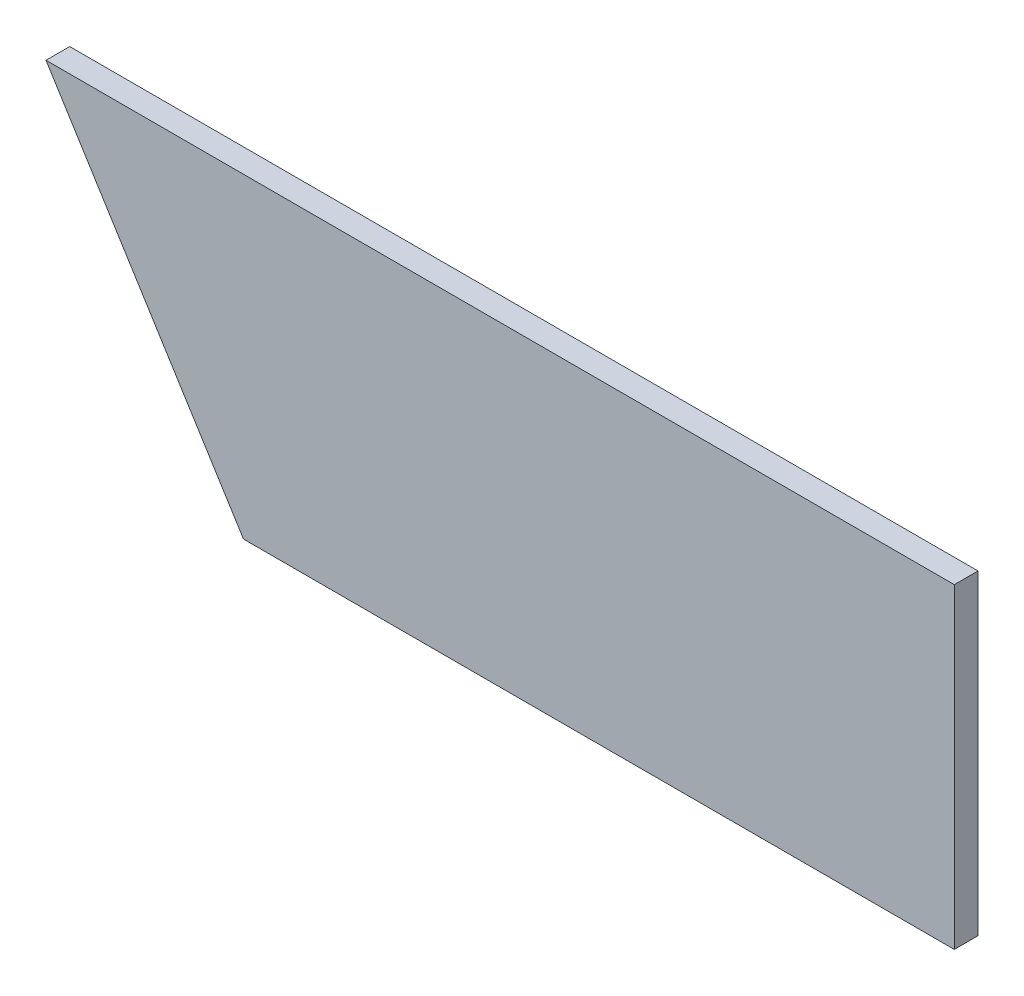
ISO-10303-21;
HEADER;
FILE_DESCRIPTION(('STEP AP214'),'2;1');
FILE_NAME('part.step','',(''),(''),'','','');
FILE_SCHEMA(('AUTOMOTIVE_DESIGN { 1 0 10303 214 1 1 1 1 }'));
ENDSEC;
DATA;
#1=APPLICATION_CONTEXT('core data for automotive mechanical design processes');
#2=APPLICATION_PROTOCOL_DEFINITION('international standard','automotive_design',2000,#1);
#3=PRODUCT_CONTEXT('',#1,'mechanical');
#4=PRODUCT('Part','Part','',(#3));
#5=PRODUCT_RELATED_PRODUCT_CATEGORY('part','',(#4));
#6=PRODUCT_DEFINITION_FORMATION('','',#4);
#7=PRODUCT_DEFINITION_CONTEXT('part definition',#1,'design');
#8=PRODUCT_DEFINITION('design','',#6,#7);
#9=PRODUCT_DEFINITION_SHAPE('','',#8);
#10=(LENGTH_UNIT() NAMED_UNIT(*) SI_UNIT(.MILLI.,.METRE.));
#11=(NAMED_UNIT(*) PLANE_ANGLE_UNIT() SI_UNIT($,.RADIAN.));
#12=(NAMED_UNIT(*) SI_UNIT($,.STERADIAN.) SOLID_ANGLE_UNIT());
#13=UNCERTAINTY_MEASURE_WITH_UNIT(LENGTH_MEASURE(1.E-05),#10,'distance_accuracy_value','');
#14=(GEOMETRIC_REPRESENTATION_CONTEXT(3) GLOBAL_UNCERTAINTY_ASSIGNED_CONTEXT((#13)) GLOBAL_UNIT_ASSIGNED_CONTEXT((#10,
#11,#12)) REPRESENTATION_CONTEXT('',''));
#15=CARTESIAN_POINT('',(0.,0.,0.));
#16=DIRECTION('',(0.,0.,1.));
#17=DIRECTION('',(1.,0.,0.));
#18=AXIS2_PLACEMENT_3D('',#15,#16,#17);
#19=CARTESIAN_POINT('',(115.,0.,-3.));
#20=DIRECTION('',(1.,0.,0.));
#21=DIRECTION('',(0.,0.,-1.));
#22=AXIS2_PLACEMENT_3D('',#19,#20,#21);
#23=PLANE('',#22);
#24=DIRECTION('',(0.,1.,0.));
#25=VECTOR('',#24,1.);
#26=CARTESIAN_POINT('',(115.,0.,0.));
#27=LINE('',#26,#25);
#28=CARTESIAN_POINT('',(115.,0.,0.));
#29=VERTEX_POINT('',#28);
#30=CARTESIAN_POINT('',(115.,40.,0.));
#31=VERTEX_POINT('',#30);
#32=EDGE_CURVE('E103',#29,#31,#27,.T.);
#33=ORIENTED_EDGE('',*,*,#32,.F.);
#34=DIRECTION('',(0.,0.,1.));
#35=VECTOR('',#34,1.);
#36=CARTESIAN_POINT('',(115.,0.,-3.));
#37=LINE('',#36,#35);
#38=CARTESIAN_POINT('',(115.,0.,-3.));
#39=VERTEX_POINT('',#38);
#40=EDGE_CURVE('E11',#39,#29,#37,.T.);
#41=ORIENTED_EDGE('',*,*,#40,.F.);
#42=DIRECTION('',(0.,1.,0.));
#43=VECTOR('',#42,1.);
#44=CARTESIAN_POINT('',(115.,0.,-3.));
#45=LINE('',#44,#43);
#46=CARTESIAN_POINT('',(115.,40.,-3.));
#47=VERTEX_POINT('',#46);
#48=EDGE_CURVE('E97',#39,#47,#45,.T.);
#49=ORIENTED_EDGE('',*,*,#48,.T.);
#50=DIRECTION('',(0.,0.,1.));
#51=VECTOR('',#50,1.);
#52=CARTESIAN_POINT('',(115.,40.,-3.));
#53=LINE('',#52,#51);
#54=EDGE_CURVE('E42',#47,#31,#53,.T.);
#55=ORIENTED_EDGE('',*,*,#54,.T.);
#56=EDGE_LOOP('',(#33,#41,#49,#55));
#57=FACE_BOUND('',#56,.T.);
#58=ADVANCED_FACE('F39',(#57),#23,.T.);
#59=CARTESIAN_POINT('',(25.,0.,-3.));
#60=DIRECTION('',(0.,-1.,0.));
#61=DIRECTION('',(1.,0.,0.));
#62=AXIS2_PLACEMENT_3D('',#59,#60,#61);
#63=PLANE('',#62);
#64=DIRECTION('',(1.,0.,0.));
#65=VECTOR('',#64,1.);
#66=CARTESIAN_POINT('',(25.,0.,0.));
#67=LINE('',#66,#65);
#68=CARTESIAN_POINT('',(25.,0.,0.));
#69=VERTEX_POINT('',#68);
#70=EDGE_CURVE('E99',#69,#29,#67,.T.);
#71=ORIENTED_EDGE('',*,*,#70,.F.);
#72=DIRECTION('',(0.,0.,1.));
#73=VECTOR('',#72,1.);
#74=CARTESIAN_POINT('',(25.,0.,-3.));
#75=LINE('',#74,#73);
#76=CARTESIAN_POINT('',(25.,0.,-3.));
#77=VERTEX_POINT('',#76);
#78=EDGE_CURVE('E48',#77,#69,#75,.T.);
#79=ORIENTED_EDGE('',*,*,#78,.F.);
#80=DIRECTION('',(1.,0.,0.));
#81=VECTOR('',#80,1.);
#82=CARTESIAN_POINT('',(25.,0.,-3.));
#83=LINE('',#82,#81);
#84=EDGE_CURVE('E94',#77,#39,#83,.T.);
#85=ORIENTED_EDGE('',*,*,#84,.T.);
#86=ORIENTED_EDGE('',*,*,#40,.T.);
#87=EDGE_LOOP('',(#71,#79,#85,#86));
#88=FACE_BOUND('',#87,.T.);
#89=ADVANCED_FACE('F113',(#88),#63,.T.);
#90=CARTESIAN_POINT('',(0.,40.,-3.));
#91=DIRECTION('',(-0.847998304005088,-0.52999894000318,0.));
#92=DIRECTION('',(0.52999894000318,-0.847998304005088,0.));
#93=AXIS2_PLACEMENT_3D('',#90,#91,#92);
#94=PLANE('',#93);
#95=DIRECTION('',(0.52999894000318,-0.847998304005088,0.));
#96=VECTOR('',#95,1.);
#97=CARTESIAN_POINT('',(0.,40.,0.));
#98=LINE('',#97,#96);
#99=CARTESIAN_POINT('',(0.,40.,0.));
#100=VERTEX_POINT('',#99);
#101=EDGE_CURVE('E89',#100,#69,#98,.T.);
#102=ORIENTED_EDGE('',*,*,#101,.F.);
#103=DIRECTION('',(0.,0.,1.));
#104=VECTOR('',#103,1.);
#105=CARTESIAN_POINT('',(0.,40.,-3.));
#106=LINE('',#105,#104);
#107=CARTESIAN_POINT('',(0.,40.,-3.));
#108=VERTEX_POINT('',#107);
#109=EDGE_CURVE('E84',#108,#100,#106,.T.);
#110=ORIENTED_EDGE('',*,*,#109,.F.);
#111=DIRECTION('',(0.52999894000318,-0.847998304005088,0.));
#112=VECTOR('',#111,1.);
#113=CARTESIAN_POINT('',(0.,40.,-3.));
#114=LINE('',#113,#112);
#115=EDGE_CURVE('E87',#108,#77,#114,.T.);
#116=ORIENTED_EDGE('',*,*,#115,.T.);
#117=ORIENTED_EDGE('',*,*,#78,.T.);
#118=EDGE_LOOP('',(#102,#110,#116,#117));
#119=FACE_BOUND('',#118,.T.);
#120=ADVANCED_FACE('F86',(#119),#94,.T.);
#121=CARTESIAN_POINT('',(0.,40.,-3.));
#122=DIRECTION('',(0.,1.,0.));
#123=DIRECTION('',(0.,0.,1.));
#124=AXIS2_PLACEMENT_3D('',#121,#122,#123);
#125=PLANE('',#124);
#126=DIRECTION('',(-1.,0.,0.));
#127=VECTOR('',#126,1.);
#128=CARTESIAN_POINT('',(0.,40.,0.));
#129=LINE('',#128,#127);
#130=EDGE_CURVE('E106',#31,#100,#129,.T.);
#131=ORIENTED_EDGE('',*,*,#130,.F.);
#132=ORIENTED_EDGE('',*,*,#54,.F.);
#133=DIRECTION('',(-1.,0.,0.));
#134=VECTOR('',#133,1.);
#135=CARTESIAN_POINT('',(0.,40.,-3.));
#136=LINE('',#135,#134);
#137=EDGE_CURVE('E93',#47,#108,#136,.T.);
#138=ORIENTED_EDGE('',*,*,#137,.T.);
#139=ORIENTED_EDGE('',*,*,#109,.T.);
#140=EDGE_LOOP('',(#131,#132,#138,#139));
#141=FACE_BOUND('',#140,.T.);
#142=ADVANCED_FACE('F96',(#141),#125,.T.);
#143=CARTESIAN_POINT('',(0.,0.,-3.));
#144=DIRECTION('',(0.,0.,-1.));
#145=DIRECTION('',(-1.,0.,0.));
#146=AXIS2_PLACEMENT_3D('',#143,#144,#145);
#147=PLANE('',#146);
#148=ORIENTED_EDGE('',*,*,#48,.F.);
#149=ORIENTED_EDGE('',*,*,#84,.F.);
#150=ORIENTED_EDGE('',*,*,#115,.F.);
#151=ORIENTED_EDGE('',*,*,#137,.F.);
#152=EDGE_LOOP('',(#148,#149,#150,#151));
#153=FACE_BOUND('',#152,.T.);
#154=ADVANCED_FACE('F92',(#153),#147,.T.);
#155=CARTESIAN_POINT('',(0.,0.,0.));
#156=DIRECTION('',(0.,0.,-1.));
#157=DIRECTION('',(-1.,0.,0.));
#158=AXIS2_PLACEMENT_3D('',#155,#156,#157);
#159=PLANE('',#158);
#160=ORIENTED_EDGE('',*,*,#32,.T.);
#161=ORIENTED_EDGE('',*,*,#130,.T.);
#162=ORIENTED_EDGE('',*,*,#101,.T.);
#163=ORIENTED_EDGE('',*,*,#70,.T.);
#164=EDGE_LOOP('',(#160,#161,#162,#163));
#165=FACE_BOUND('',#164,.T.);
#166=ADVANCED_FACE('F112',(#165),#159,.F.);
#167=CLOSED_SHELL('',(#58,#89,#120,#142,#154,#166));
#168=MANIFOLD_SOLID_BREP('B2',#167);
#169=ADVANCED_BREP_SHAPE_REPRESENTATION('',(#18,#168),#14);
#170=SHAPE_DEFINITION_REPRESENTATION(#9,#169);
ENDSEC;
END-ISO-10303-21;
